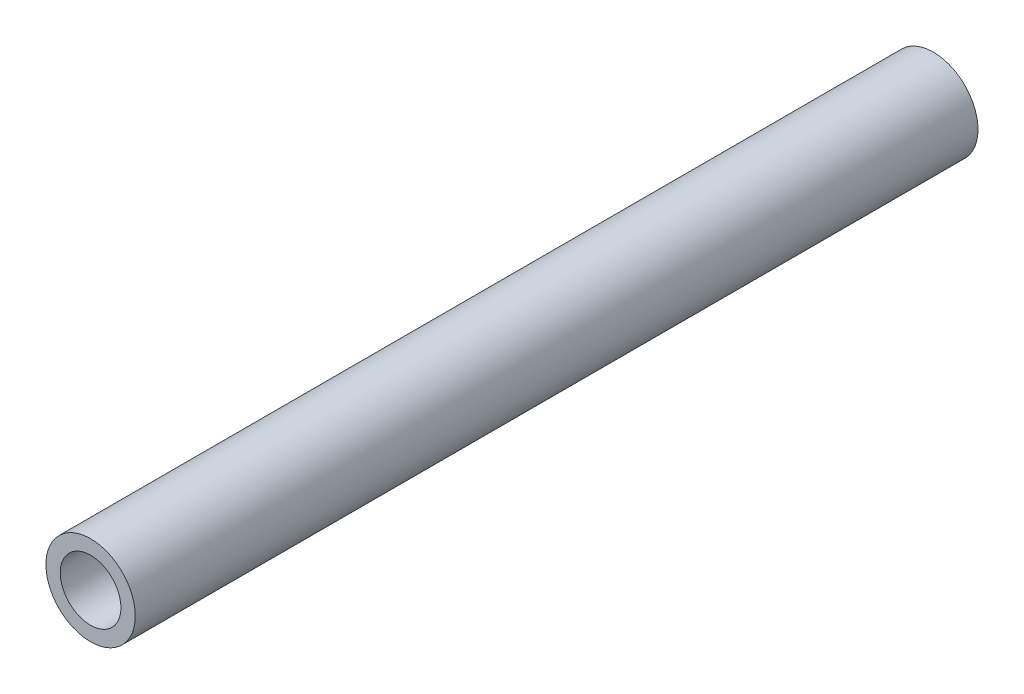
ISO-10303-21;
HEADER;
FILE_DESCRIPTION(('STEP AP214'),'2;1');
FILE_NAME('part.step','',(''),(''),'','','');
FILE_SCHEMA(('AUTOMOTIVE_DESIGN { 1 0 10303 214 1 1 1 1 }'));
ENDSEC;
DATA;
#1=APPLICATION_CONTEXT('core data for automotive mechanical design processes');
#2=APPLICATION_PROTOCOL_DEFINITION('international standard','automotive_design',2000,#1);
#3=PRODUCT_CONTEXT('',#1,'mechanical');
#4=PRODUCT('Part','Part','',(#3));
#5=PRODUCT_RELATED_PRODUCT_CATEGORY('part','',(#4));
#6=PRODUCT_DEFINITION_FORMATION('','',#4);
#7=PRODUCT_DEFINITION_CONTEXT('part definition',#1,'design');
#8=PRODUCT_DEFINITION('design','',#6,#7);
#9=PRODUCT_DEFINITION_SHAPE('','',#8);
#10=(LENGTH_UNIT() NAMED_UNIT(*) SI_UNIT(.MILLI.,.METRE.));
#11=(NAMED_UNIT(*) PLANE_ANGLE_UNIT() SI_UNIT($,.RADIAN.));
#12=(NAMED_UNIT(*) SI_UNIT($,.STERADIAN.) SOLID_ANGLE_UNIT());
#13=UNCERTAINTY_MEASURE_WITH_UNIT(LENGTH_MEASURE(1.E-05),#10,'distance_accuracy_value','');
#14=(GEOMETRIC_REPRESENTATION_CONTEXT(3) GLOBAL_UNCERTAINTY_ASSIGNED_CONTEXT((#13)) GLOBAL_UNIT_ASSIGNED_CONTEXT((#10,
#11,#12)) REPRESENTATION_CONTEXT('',''));
#15=CARTESIAN_POINT('',(0.,0.,0.));
#16=DIRECTION('',(0.,0.,1.));
#17=DIRECTION('',(1.,0.,0.));
#18=AXIS2_PLACEMENT_3D('',#15,#16,#17);
#19=CARTESIAN_POINT('',(0.,0.,50.));
#20=DIRECTION('',(0.,0.,1.));
#21=DIRECTION('',(1.,0.,0.));
#22=AXIS2_PLACEMENT_3D('',#19,#20,#21);
#23=PLANE('',#22);
#24=CARTESIAN_POINT('',(0.,0.,50.));
#25=DIRECTION('',(0.,0.,1.));
#26=DIRECTION('',(1.,0.,0.));
#27=AXIS2_PLACEMENT_3D('',#24,#25,#26);
#28=CIRCLE('',#27,2.65);
#29=CARTESIAN_POINT('',(2.65,0.,50.));
#30=VERTEX_POINT('',#29);
#31=EDGE_CURVE('E10',#30,#30,#28,.T.);
#32=ORIENTED_EDGE('',*,*,#31,.T.);
#33=EDGE_LOOP('',(#32));
#34=FACE_BOUND('',#33,.T.);
#35=CARTESIAN_POINT('',(0.,0.,50.));
#36=DIRECTION('',(0.,0.,1.));
#37=DIRECTION('',(1.,0.,0.));
#38=AXIS2_PLACEMENT_3D('',#35,#36,#37);
#39=CIRCLE('',#38,1.8);
#40=CARTESIAN_POINT('',(1.8,0.,50.));
#41=VERTEX_POINT('',#40);
#42=EDGE_CURVE('E50',#41,#41,#39,.T.);
#43=ORIENTED_EDGE('',*,*,#42,.F.);
#44=EDGE_LOOP('',(#43));
#45=FACE_BOUND('',#44,.T.);
#46=ADVANCED_FACE('F37',(#34,#45),#23,.T.);
#47=CARTESIAN_POINT('',(0.,0.,0.));
#48=DIRECTION('',(0.,0.,1.));
#49=DIRECTION('',(1.,0.,0.));
#50=AXIS2_PLACEMENT_3D('',#47,#48,#49);
#51=PLANE('',#50);
#52=CARTESIAN_POINT('',(0.,0.,0.));
#53=DIRECTION('',(0.,0.,1.));
#54=DIRECTION('',(1.,0.,0.));
#55=AXIS2_PLACEMENT_3D('',#52,#53,#54);
#56=CIRCLE('',#55,2.65);
#57=CARTESIAN_POINT('',(2.65,0.,0.));
#58=VERTEX_POINT('',#57);
#59=EDGE_CURVE('E41',#58,#58,#56,.T.);
#60=ORIENTED_EDGE('',*,*,#59,.F.);
#61=EDGE_LOOP('',(#60));
#62=FACE_BOUND('',#61,.T.);
#63=CARTESIAN_POINT('',(0.,0.,0.));
#64=DIRECTION('',(0.,0.,1.));
#65=DIRECTION('',(1.,0.,0.));
#66=AXIS2_PLACEMENT_3D('',#63,#64,#65);
#67=CIRCLE('',#66,1.8);
#68=CARTESIAN_POINT('',(1.8,0.,0.));
#69=VERTEX_POINT('',#68);
#70=EDGE_CURVE('E52',#69,#69,#67,.T.);
#71=ORIENTED_EDGE('',*,*,#70,.T.);
#72=EDGE_LOOP('',(#71));
#73=FACE_BOUND('',#72,.T.);
#74=ADVANCED_FACE('F64',(#62,#73),#51,.F.);
#75=CARTESIAN_POINT('',(0.,0.,50.));
#76=DIRECTION('',(0.,0.,-1.));
#77=DIRECTION('',(-1.,0.,0.));
#78=AXIS2_PLACEMENT_3D('',#75,#76,#77);
#79=CYLINDRICAL_SURFACE('',#78,2.65);
#80=ORIENTED_EDGE('',*,*,#31,.F.);
#81=EDGE_LOOP('',(#80));
#82=FACE_BOUND('',#81,.T.);
#83=ORIENTED_EDGE('',*,*,#59,.T.);
#84=EDGE_LOOP('',(#83));
#85=FACE_BOUND('',#84,.T.);
#86=ADVANCED_FACE('F39',(#82,#85),#79,.T.);
#87=CARTESIAN_POINT('',(0.,0.,50.));
#88=DIRECTION('',(0.,0.,-1.));
#89=DIRECTION('',(-1.,0.,0.));
#90=AXIS2_PLACEMENT_3D('',#87,#88,#89);
#91=CYLINDRICAL_SURFACE('',#90,1.8);
#92=ORIENTED_EDGE('',*,*,#42,.T.);
#93=EDGE_LOOP('',(#92));
#94=FACE_BOUND('',#93,.T.);
#95=ORIENTED_EDGE('',*,*,#70,.F.);
#96=EDGE_LOOP('',(#95));
#97=FACE_BOUND('',#96,.T.);
#98=ADVANCED_FACE('F60',(#94,#97),#91,.F.);
#99=CLOSED_SHELL('',(#46,#74,#86,#98));
#100=MANIFOLD_SOLID_BREP('B2',#99);
#101=ADVANCED_BREP_SHAPE_REPRESENTATION('',(#18,#100),#14);
#102=SHAPE_DEFINITION_REPRESENTATION(#9,#101);
ENDSEC;
END-ISO-10303-21;
